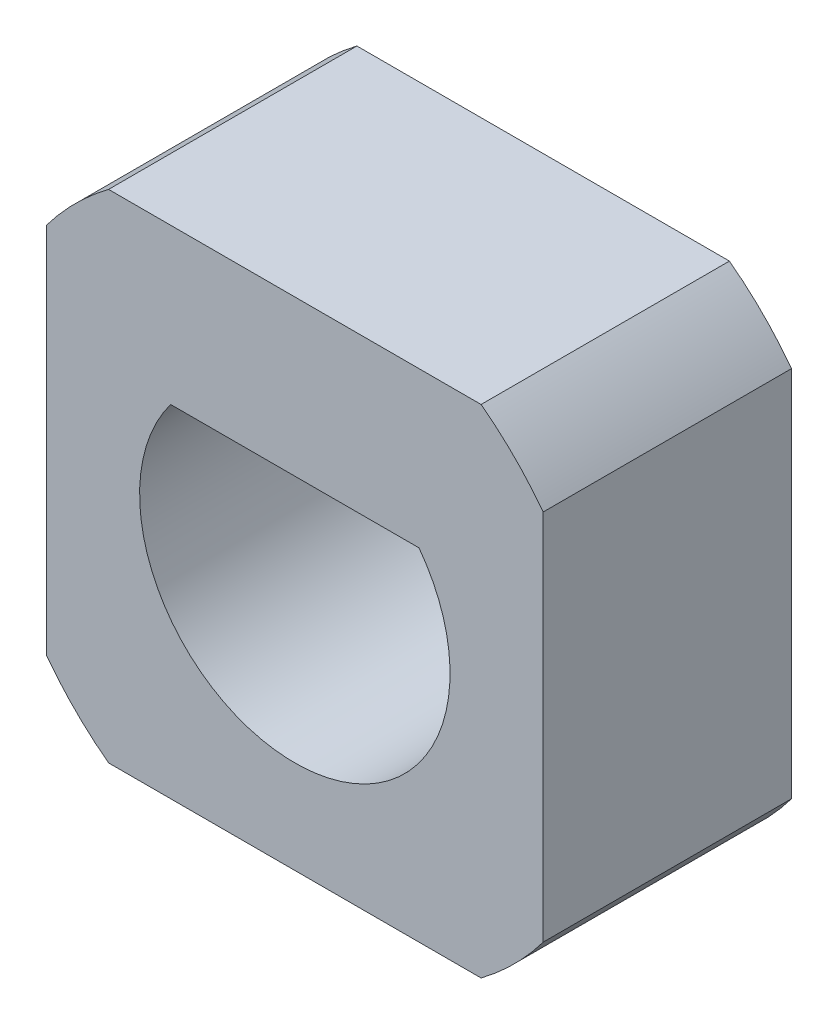
ISO-10303-21;
HEADER;
FILE_DESCRIPTION(('STEP AP214'),'2;1');
FILE_NAME('part.step','',(''),(''),'','','');
FILE_SCHEMA(('AUTOMOTIVE_DESIGN { 1 0 10303 214 1 1 1 1 }'));
ENDSEC;
DATA;
#1=APPLICATION_CONTEXT('core data for automotive mechanical design processes');
#2=APPLICATION_PROTOCOL_DEFINITION('international standard','automotive_design',2000,#1);
#3=PRODUCT_CONTEXT('',#1,'mechanical');
#4=PRODUCT('Part','Part','',(#3));
#5=PRODUCT_RELATED_PRODUCT_CATEGORY('part','',(#4));
#6=PRODUCT_DEFINITION_FORMATION('','',#4);
#7=PRODUCT_DEFINITION_CONTEXT('part definition',#1,'design');
#8=PRODUCT_DEFINITION('design','',#6,#7);
#9=PRODUCT_DEFINITION_SHAPE('','',#8);
#10=(LENGTH_UNIT() NAMED_UNIT(*) SI_UNIT(.MILLI.,.METRE.));
#11=(NAMED_UNIT(*) PLANE_ANGLE_UNIT() SI_UNIT($,.RADIAN.));
#12=(NAMED_UNIT(*) SI_UNIT($,.STERADIAN.) SOLID_ANGLE_UNIT());
#13=UNCERTAINTY_MEASURE_WITH_UNIT(LENGTH_MEASURE(1.E-05),#10,'distance_accuracy_value','');
#14=(GEOMETRIC_REPRESENTATION_CONTEXT(3) GLOBAL_UNCERTAINTY_ASSIGNED_CONTEXT((#13)) GLOBAL_UNIT_ASSIGNED_CONTEXT((#10,
#11,#12)) REPRESENTATION_CONTEXT('',''));
#15=CARTESIAN_POINT('',(0.,0.,0.));
#16=DIRECTION('',(0.,0.,1.));
#17=DIRECTION('',(1.,0.,0.));
#18=AXIS2_PLACEMENT_3D('',#15,#16,#17);
#19=CARTESIAN_POINT('',(0.,-1.35,9.35));
#20=DIRECTION('',(0.,0.,1.));
#21=DIRECTION('',(1.,0.,0.));
#22=AXIS2_PLACEMENT_3D('',#19,#20,#21);
#23=PLANE('',#22);
#24=CARTESIAN_POINT('',(0.,-1.35,9.35));
#25=DIRECTION('',(0.,0.,-1.));
#26=DIRECTION('',(-0.6,-0.8,0.));
#27=AXIS2_PLACEMENT_3D('',#24,#25,#26);
#28=CIRCLE('',#27,5.);
#29=CARTESIAN_POINT('',(-3.,-5.35,9.35));
#30=VERTEX_POINT('',#29);
#31=CARTESIAN_POINT('',(-4.,-4.35,9.35));
#32=VERTEX_POINT('',#31);
#33=EDGE_CURVE('E189',#30,#32,#28,.T.);
#34=ORIENTED_EDGE('',*,*,#33,.T.);
#35=DIRECTION('',(1.333451867438E-12,1.,0.));
#36=VECTOR('',#35,1.);
#37=CARTESIAN_POINT('',(-4.,-4.35,9.35));
#38=LINE('',#37,#36);
#39=CARTESIAN_POINT('',(-3.999999999992,1.650000000022,9.35));
#40=VERTEX_POINT('',#39);
#41=EDGE_CURVE('E212',#32,#40,#38,.T.);
#42=ORIENTED_EDGE('',*,*,#41,.T.);
#43=CARTESIAN_POINT('',(0.,-1.35,9.35));
#44=DIRECTION('',(0.,0.,-1.));
#45=DIRECTION('',(-0.7999999999997,0.6000000000004,0.));
#46=AXIS2_PLACEMENT_3D('',#43,#44,#45);
#47=CIRCLE('',#46,5.);
#48=CARTESIAN_POINT('',(-3.,2.65,9.35));
#49=VERTEX_POINT('',#48);
#50=EDGE_CURVE('E201',#40,#49,#47,.T.);
#51=ORIENTED_EDGE('',*,*,#50,.T.);
#52=DIRECTION('',(1.,-2.023566499549E-13,0.));
#53=VECTOR('',#52,1.);
#54=CARTESIAN_POINT('',(-3.,2.65,9.35));
#55=LINE('',#54,#53);
#56=CARTESIAN_POINT('',(3.000000000003,2.649999999999,9.35));
#57=VERTEX_POINT('',#56);
#58=EDGE_CURVE('E172',#49,#57,#55,.T.);
#59=ORIENTED_EDGE('',*,*,#58,.T.);
#60=CARTESIAN_POINT('',(0.,-1.35,9.35));
#61=DIRECTION('',(0.,0.,-1.));
#62=DIRECTION('',(0.600000000000064,0.799999999999952,0.));
#63=AXIS2_PLACEMENT_3D('',#60,#61,#62);
#64=CIRCLE('',#63,5.);
#65=CARTESIAN_POINT('',(4.,1.65,9.35));
#66=VERTEX_POINT('',#65);
#67=EDGE_CURVE('E157',#57,#66,#64,.T.);
#68=ORIENTED_EDGE('',*,*,#67,.T.);
#69=DIRECTION('',(6.008527009281E-13,-1.,0.));
#70=VECTOR('',#69,1.);
#71=CARTESIAN_POINT('',(4.,1.65,9.35));
#72=LINE('',#71,#70);
#73=CARTESIAN_POINT('',(4.000000000001,-4.349999999999,9.35));
#74=VERTEX_POINT('',#73);
#75=EDGE_CURVE('E176',#66,#74,#72,.T.);
#76=ORIENTED_EDGE('',*,*,#75,.T.);
#77=CARTESIAN_POINT('',(0.,-1.35,9.35));
#78=DIRECTION('',(0.,0.,-1.));
#79=DIRECTION('',(0.800000000000132,-0.599999999999824,0.));
#80=AXIS2_PLACEMENT_3D('',#77,#78,#79);
#81=CIRCLE('',#80,5.);
#82=CARTESIAN_POINT('',(3.,-5.35,9.35));
#83=VERTEX_POINT('',#82);
#84=EDGE_CURVE('E144',#74,#83,#81,.T.);
#85=ORIENTED_EDGE('',*,*,#84,.T.);
#86=DIRECTION('',(-1.,0.,0.));
#87=VECTOR('',#86,1.);
#88=CARTESIAN_POINT('',(3.,-5.35,9.35));
#89=LINE('',#88,#87);
#90=EDGE_CURVE('E11',#83,#30,#89,.T.);
#91=ORIENTED_EDGE('',*,*,#90,.T.);
#92=EDGE_LOOP('',(#34,#42,#51,#59,#68,#76,#85,#91));
#93=FACE_BOUND('',#92,.T.);
#94=DIRECTION('',(1.,0.,0.));
#95=VECTOR('',#94,1.);
#96=CARTESIAN_POINT('',(-2.,0.15,9.35));
#97=LINE('',#96,#95);
#98=CARTESIAN_POINT('',(-2.,0.15,9.35));
#99=VERTEX_POINT('',#98);
#100=CARTESIAN_POINT('',(2.,0.15,9.35));
#101=VERTEX_POINT('',#100);
#102=EDGE_CURVE('E134',#99,#101,#97,.T.);
#103=ORIENTED_EDGE('',*,*,#102,.F.);
#104=CARTESIAN_POINT('',(0.,-1.35,9.35));
#105=DIRECTION('',(0.,0.,1.));
#106=DIRECTION('',(-0.8,0.6,0.));
#107=AXIS2_PLACEMENT_3D('',#104,#105,#106);
#108=CIRCLE('',#107,2.5);
#109=EDGE_CURVE('E125',#99,#101,#108,.T.);
#110=ORIENTED_EDGE('',*,*,#109,.T.);
#111=EDGE_LOOP('',(#103,#110));
#112=FACE_BOUND('',#111,.T.);
#113=ADVANCED_FACE('F16',(#93,#112),#23,.F.);
#114=CARTESIAN_POINT('',(0.,-5.35,9.35));
#115=DIRECTION('',(0.,-1.,0.));
#116=DIRECTION('',(0.,0.,-1.));
#117=AXIS2_PLACEMENT_3D('',#114,#115,#116);
#118=PLANE('',#117);
#119=DIRECTION('',(0.,0.,1.));
#120=VECTOR('',#119,1.);
#121=CARTESIAN_POINT('',(-3.,-5.35,9.35));
#122=LINE('',#121,#120);
#123=CARTESIAN_POINT('',(-3.,-5.35,13.35));
#124=VERTEX_POINT('',#123);
#125=EDGE_CURVE('E184',#30,#124,#122,.T.);
#126=ORIENTED_EDGE('',*,*,#125,.F.);
#127=ORIENTED_EDGE('',*,*,#90,.F.);
#128=DIRECTION('',(0.,0.,-1.));
#129=VECTOR('',#128,1.);
#130=CARTESIAN_POINT('',(3.,-5.35,13.35));
#131=LINE('',#130,#129);
#132=CARTESIAN_POINT('',(3.,-5.35,13.35));
#133=VERTEX_POINT('',#132);
#134=EDGE_CURVE('E124',#133,#83,#131,.T.);
#135=ORIENTED_EDGE('',*,*,#134,.F.);
#136=DIRECTION('',(-1.,0.,0.));
#137=VECTOR('',#136,1.);
#138=CARTESIAN_POINT('',(3.,-5.35,13.35));
#139=LINE('',#138,#137);
#140=EDGE_CURVE('E24',#133,#124,#139,.T.);
#141=ORIENTED_EDGE('',*,*,#140,.T.);
#142=EDGE_LOOP('',(#126,#127,#135,#141));
#143=FACE_BOUND('',#142,.T.);
#144=ADVANCED_FACE('F235',(#143),#118,.T.);
#145=CARTESIAN_POINT('',(0.,-1.35,13.35));
#146=DIRECTION('',(0.,0.,1.));
#147=DIRECTION('',(1.,0.,0.));
#148=AXIS2_PLACEMENT_3D('',#145,#146,#147);
#149=PLANE('',#148);
#150=ORIENTED_EDGE('',*,*,#140,.F.);
#151=CARTESIAN_POINT('',(0.,-1.35,13.35));
#152=DIRECTION('',(0.,0.,1.));
#153=DIRECTION('',(0.6,-0.8,0.));
#154=AXIS2_PLACEMENT_3D('',#151,#152,#153);
#155=CIRCLE('',#154,5.);
#156=CARTESIAN_POINT('',(4.000000000004,-4.34999999999,13.35));
#157=VERTEX_POINT('',#156);
#158=EDGE_CURVE('E166',#133,#157,#155,.T.);
#159=ORIENTED_EDGE('',*,*,#158,.T.);
#160=DIRECTION('',(6.006306563232E-13,-1.,0.));
#161=VECTOR('',#160,1.);
#162=CARTESIAN_POINT('',(4.,1.65,13.35));
#163=LINE('',#162,#161);
#164=CARTESIAN_POINT('',(4.,1.65,13.35));
#165=VERTEX_POINT('',#164);
#166=EDGE_CURVE('E183',#165,#157,#163,.T.);
#167=ORIENTED_EDGE('',*,*,#166,.F.);
#168=CARTESIAN_POINT('',(0.,-1.35,13.35));
#169=DIRECTION('',(0.,0.,1.));
#170=DIRECTION('',(0.8,0.6,0.));
#171=AXIS2_PLACEMENT_3D('',#168,#169,#170);
#172=CIRCLE('',#171,5.);
#173=CARTESIAN_POINT('',(3.,2.65,13.35));
#174=VERTEX_POINT('',#173);
#175=EDGE_CURVE('E156',#165,#174,#172,.T.);
#176=ORIENTED_EDGE('',*,*,#175,.T.);
#177=DIRECTION('',(1.,-2.023566499549E-13,0.));
#178=VECTOR('',#177,1.);
#179=CARTESIAN_POINT('',(-3.,2.65,13.35));
#180=LINE('',#179,#178);
#181=CARTESIAN_POINT('',(-3.,2.65,13.35));
#182=VERTEX_POINT('',#181);
#183=EDGE_CURVE('E171',#182,#174,#180,.T.);
#184=ORIENTED_EDGE('',*,*,#183,.F.);
#185=CARTESIAN_POINT('',(0.,-1.35,13.35));
#186=DIRECTION('',(0.,0.,1.));
#187=DIRECTION('',(-0.6,0.8,0.));
#188=AXIS2_PLACEMENT_3D('',#185,#186,#187);
#189=CIRCLE('',#188,5.);
#190=CARTESIAN_POINT('',(-3.999999999992,1.650000000022,13.35));
#191=VERTEX_POINT('',#190);
#192=EDGE_CURVE('E208',#182,#191,#189,.T.);
#193=ORIENTED_EDGE('',*,*,#192,.T.);
#194=DIRECTION('',(1.333451867438E-12,1.,0.));
#195=VECTOR('',#194,1.);
#196=CARTESIAN_POINT('',(-4.,-4.35,13.35));
#197=LINE('',#196,#195);
#198=CARTESIAN_POINT('',(-4.,-4.35,13.35));
#199=VERTEX_POINT('',#198);
#200=EDGE_CURVE('E219',#199,#191,#197,.T.);
#201=ORIENTED_EDGE('',*,*,#200,.F.);
#202=CARTESIAN_POINT('',(0.,-1.35,13.35));
#203=DIRECTION('',(0.,0.,1.));
#204=DIRECTION('',(-0.8,-0.6,0.));
#205=AXIS2_PLACEMENT_3D('',#202,#203,#204);
#206=CIRCLE('',#205,5.);
#207=EDGE_CURVE('E188',#199,#124,#206,.T.);
#208=ORIENTED_EDGE('',*,*,#207,.T.);
#209=EDGE_LOOP('',(#150,#159,#167,#176,#184,#193,#201,#208));
#210=FACE_BOUND('',#209,.T.);
#211=DIRECTION('',(1.,0.,0.));
#212=VECTOR('',#211,1.);
#213=CARTESIAN_POINT('',(-2.,0.15,13.35));
#214=LINE('',#213,#212);
#215=CARTESIAN_POINT('',(-2.,0.15,13.35));
#216=VERTEX_POINT('',#215);
#217=CARTESIAN_POINT('',(2.,0.15,13.35));
#218=VERTEX_POINT('',#217);
#219=EDGE_CURVE('E119',#216,#218,#214,.T.);
#220=ORIENTED_EDGE('',*,*,#219,.T.);
#221=CARTESIAN_POINT('',(0.,-1.35,13.35));
#222=DIRECTION('',(0.,0.,-1.));
#223=DIRECTION('',(0.8,0.6,0.));
#224=AXIS2_PLACEMENT_3D('',#221,#222,#223);
#225=CIRCLE('',#224,2.5);
#226=EDGE_CURVE('E115',#218,#216,#225,.T.);
#227=ORIENTED_EDGE('',*,*,#226,.T.);
#228=EDGE_LOOP('',(#220,#227));
#229=FACE_BOUND('',#228,.T.);
#230=ADVANCED_FACE('F117',(#210,#229),#149,.T.);
#231=CARTESIAN_POINT('',(0.,-1.35,9.35));
#232=DIRECTION('',(0.,0.,1.));
#233=DIRECTION('',(1.,0.,0.));
#234=AXIS2_PLACEMENT_3D('',#231,#232,#233);
#235=CYLINDRICAL_SURFACE('',#234,5.);
#236=DIRECTION('',(0.,0.,-1.));
#237=VECTOR('',#236,1.);
#238=CARTESIAN_POINT('',(-4.,-4.35,13.35));
#239=LINE('',#238,#237);
#240=EDGE_CURVE('E215',#199,#32,#239,.T.);
#241=ORIENTED_EDGE('',*,*,#240,.T.);
#242=ORIENTED_EDGE('',*,*,#33,.F.);
#243=ORIENTED_EDGE('',*,*,#125,.T.);
#244=ORIENTED_EDGE('',*,*,#207,.F.);
#245=EDGE_LOOP('',(#241,#242,#243,#244));
#246=FACE_BOUND('',#245,.T.);
#247=ADVANCED_FACE('F234',(#246),#235,.T.);
#248=CARTESIAN_POINT('',(-4.,-1.35,9.35));
#249=DIRECTION('',(-1.,0.,0.));
#250=DIRECTION('',(0.,0.,1.));
#251=AXIS2_PLACEMENT_3D('',#248,#249,#250);
#252=PLANE('',#251);
#253=DIRECTION('',(0.,0.,1.));
#254=VECTOR('',#253,1.);
#255=CARTESIAN_POINT('',(-3.999999999992,1.650000000022,9.35));
#256=LINE('',#255,#254);
#257=EDGE_CURVE('E204',#40,#191,#256,.T.);
#258=ORIENTED_EDGE('',*,*,#257,.F.);
#259=ORIENTED_EDGE('',*,*,#41,.F.);
#260=ORIENTED_EDGE('',*,*,#240,.F.);
#261=ORIENTED_EDGE('',*,*,#200,.T.);
#262=EDGE_LOOP('',(#258,#259,#260,#261));
#263=FACE_BOUND('',#262,.T.);
#264=ADVANCED_FACE('F261',(#263),#252,.T.);
#265=CARTESIAN_POINT('',(0.,-1.35,9.35));
#266=DIRECTION('',(0.,0.,1.));
#267=DIRECTION('',(1.,0.,0.));
#268=AXIS2_PLACEMENT_3D('',#265,#266,#267);
#269=CYLINDRICAL_SURFACE('',#268,5.);
#270=DIRECTION('',(0.,0.,-1.));
#271=VECTOR('',#270,1.);
#272=CARTESIAN_POINT('',(-3.,2.65,13.35));
#273=LINE('',#272,#271);
#274=EDGE_CURVE('E167',#182,#49,#273,.T.);
#275=ORIENTED_EDGE('',*,*,#274,.T.);
#276=ORIENTED_EDGE('',*,*,#50,.F.);
#277=ORIENTED_EDGE('',*,*,#257,.T.);
#278=ORIENTED_EDGE('',*,*,#192,.F.);
#279=EDGE_LOOP('',(#275,#276,#277,#278));
#280=FACE_BOUND('',#279,.T.);
#281=ADVANCED_FACE('F258',(#280),#269,.T.);
#282=CARTESIAN_POINT('',(0.,2.65,9.35));
#283=DIRECTION('',(0.,1.,0.));
#284=DIRECTION('',(1.,0.,0.));
#285=AXIS2_PLACEMENT_3D('',#282,#283,#284);
#286=PLANE('',#285);
#287=DIRECTION('',(0.,0.,1.));
#288=VECTOR('',#287,1.);
#289=CARTESIAN_POINT('',(3.000000000003,2.649999999999,9.35));
#290=LINE('',#289,#288);
#291=EDGE_CURVE('E152',#57,#174,#290,.T.);
#292=ORIENTED_EDGE('',*,*,#291,.F.);
#293=ORIENTED_EDGE('',*,*,#58,.F.);
#294=ORIENTED_EDGE('',*,*,#274,.F.);
#295=ORIENTED_EDGE('',*,*,#183,.T.);
#296=EDGE_LOOP('',(#292,#293,#294,#295));
#297=FACE_BOUND('',#296,.T.);
#298=ADVANCED_FACE('F253',(#297),#286,.T.);
#299=CARTESIAN_POINT('',(0.,-1.35,9.35));
#300=DIRECTION('',(0.,0.,1.));
#301=DIRECTION('',(1.,0.,0.));
#302=AXIS2_PLACEMENT_3D('',#299,#300,#301);
#303=CYLINDRICAL_SURFACE('',#302,5.);
#304=DIRECTION('',(0.,0.,-1.));
#305=VECTOR('',#304,1.);
#306=CARTESIAN_POINT('',(4.,1.65,13.35));
#307=LINE('',#306,#305);
#308=EDGE_CURVE('E179',#165,#66,#307,.T.);
#309=ORIENTED_EDGE('',*,*,#308,.T.);
#310=ORIENTED_EDGE('',*,*,#67,.F.);
#311=ORIENTED_EDGE('',*,*,#291,.T.);
#312=ORIENTED_EDGE('',*,*,#175,.F.);
#313=EDGE_LOOP('',(#309,#310,#311,#312));
#314=FACE_BOUND('',#313,.T.);
#315=ADVANCED_FACE('F249',(#314),#303,.T.);
#316=CARTESIAN_POINT('',(4.,-1.35,9.35));
#317=DIRECTION('',(1.,0.,0.));
#318=DIRECTION('',(0.,1.,0.));
#319=AXIS2_PLACEMENT_3D('',#316,#317,#318);
#320=PLANE('',#319);
#321=DIRECTION('',(0.,0.,1.));
#322=VECTOR('',#321,1.);
#323=CARTESIAN_POINT('',(4.000000000004,-4.34999999999,9.35));
#324=LINE('',#323,#322);
#325=EDGE_CURVE('E146',#74,#157,#324,.T.);
#326=ORIENTED_EDGE('',*,*,#325,.F.);
#327=ORIENTED_EDGE('',*,*,#75,.F.);
#328=ORIENTED_EDGE('',*,*,#308,.F.);
#329=ORIENTED_EDGE('',*,*,#166,.T.);
#330=EDGE_LOOP('',(#326,#327,#328,#329));
#331=FACE_BOUND('',#330,.T.);
#332=ADVANCED_FACE('F246',(#331),#320,.T.);
#333=CARTESIAN_POINT('',(0.,-1.35,9.35));
#334=DIRECTION('',(0.,0.,1.));
#335=DIRECTION('',(1.,0.,0.));
#336=AXIS2_PLACEMENT_3D('',#333,#334,#335);
#337=CYLINDRICAL_SURFACE('',#336,5.);
#338=ORIENTED_EDGE('',*,*,#134,.T.);
#339=ORIENTED_EDGE('',*,*,#84,.F.);
#340=ORIENTED_EDGE('',*,*,#325,.T.);
#341=ORIENTED_EDGE('',*,*,#158,.F.);
#342=EDGE_LOOP('',(#338,#339,#340,#341));
#343=FACE_BOUND('',#342,.T.);
#344=ADVANCED_FACE('F241',(#343),#337,.T.);
#345=CARTESIAN_POINT('',(0.,-1.35,9.35));
#346=DIRECTION('',(0.,0.,1.));
#347=DIRECTION('',(1.,0.,0.));
#348=AXIS2_PLACEMENT_3D('',#345,#346,#347);
#349=CYLINDRICAL_SURFACE('',#348,2.5);
#350=DIRECTION('',(0.,0.,1.));
#351=VECTOR('',#350,1.);
#352=CARTESIAN_POINT('',(2.,0.15,9.35));
#353=LINE('',#352,#351);
#354=EDGE_CURVE('E137',#101,#218,#353,.T.);
#355=ORIENTED_EDGE('',*,*,#354,.F.);
#356=ORIENTED_EDGE('',*,*,#109,.F.);
#357=DIRECTION('',(0.,0.,1.));
#358=VECTOR('',#357,1.);
#359=CARTESIAN_POINT('',(-2.,0.15,9.35));
#360=LINE('',#359,#358);
#361=EDGE_CURVE('E128',#99,#216,#360,.T.);
#362=ORIENTED_EDGE('',*,*,#361,.T.);
#363=ORIENTED_EDGE('',*,*,#226,.F.);
#364=EDGE_LOOP('',(#355,#356,#362,#363));
#365=FACE_BOUND('',#364,.T.);
#366=ADVANCED_FACE('F129',(#365),#349,.F.);
#367=CARTESIAN_POINT('',(-2.517985611505,0.15,13.35));
#368=DIRECTION('',(0.,-1.,0.));
#369=DIRECTION('',(0.,0.,-1.));
#370=AXIS2_PLACEMENT_3D('',#367,#368,#369);
#371=PLANE('',#370);
#372=ORIENTED_EDGE('',*,*,#219,.F.);
#373=ORIENTED_EDGE('',*,*,#361,.F.);
#374=ORIENTED_EDGE('',*,*,#102,.T.);
#375=ORIENTED_EDGE('',*,*,#354,.T.);
#376=EDGE_LOOP('',(#372,#373,#374,#375));
#377=FACE_BOUND('',#376,.T.);
#378=ADVANCED_FACE('F136',(#377),#371,.T.);
#379=CLOSED_SHELL('',(#113,#144,#230,#247,#264,#281,#298,#315,#332,#344,#366,#378));
#380=MANIFOLD_SOLID_BREP('B1',#379);
#381=ADVANCED_BREP_SHAPE_REPRESENTATION('',(#18,#380),#14);
#382=SHAPE_DEFINITION_REPRESENTATION(#9,#381);
ENDSEC;
END-ISO-10303-21;
